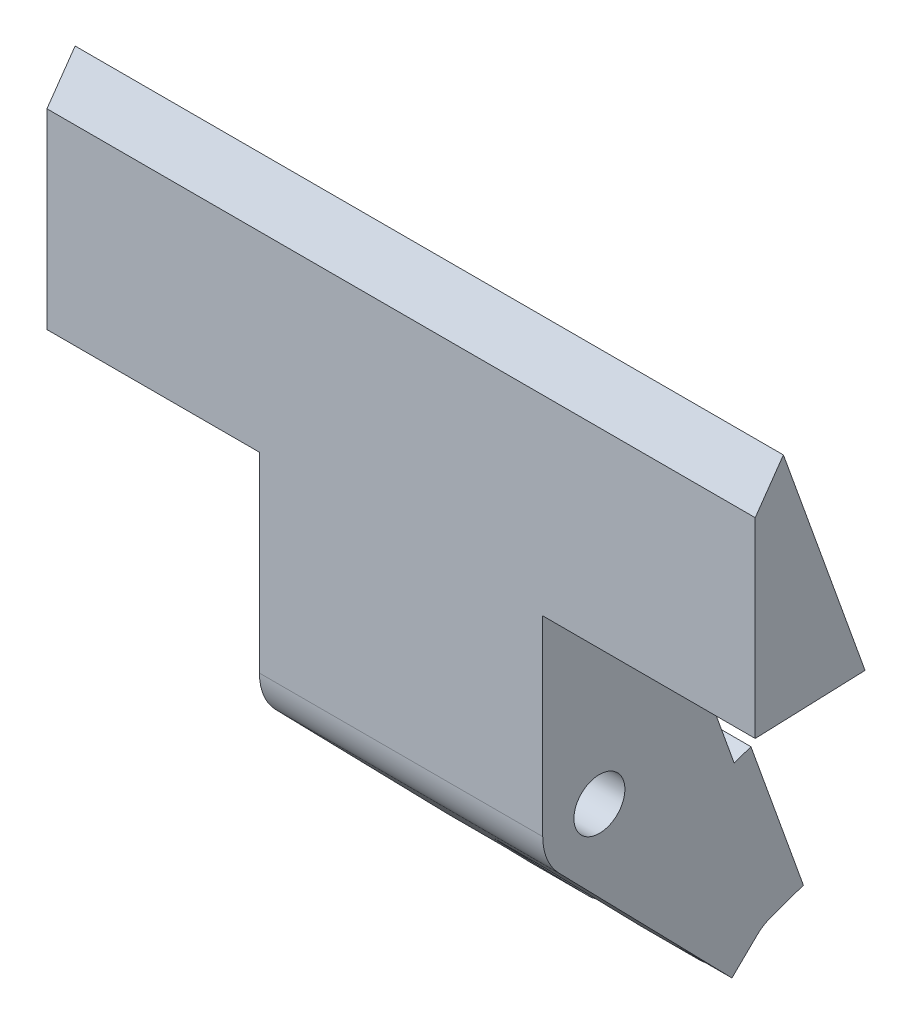
ISO-10303-21;
HEADER;
FILE_DESCRIPTION(('STEP AP214'),'2;1');
FILE_NAME('part.step','',(''),(''),'','','');
FILE_SCHEMA(('AUTOMOTIVE_DESIGN { 1 0 10303 214 1 1 1 1 }'));
ENDSEC;
DATA;
#1=APPLICATION_CONTEXT('core data for automotive mechanical design processes');
#2=APPLICATION_PROTOCOL_DEFINITION('international standard','automotive_design',2000,#1);
#3=PRODUCT_CONTEXT('',#1,'mechanical');
#4=PRODUCT('Part','Part','',(#3));
#5=PRODUCT_RELATED_PRODUCT_CATEGORY('part','',(#4));
#6=PRODUCT_DEFINITION_FORMATION('','',#4);
#7=PRODUCT_DEFINITION_CONTEXT('part definition',#1,'design');
#8=PRODUCT_DEFINITION('design','',#6,#7);
#9=PRODUCT_DEFINITION_SHAPE('','',#8);
#10=(LENGTH_UNIT() NAMED_UNIT(*) SI_UNIT(.MILLI.,.METRE.));
#11=(NAMED_UNIT(*) PLANE_ANGLE_UNIT() SI_UNIT($,.RADIAN.));
#12=(NAMED_UNIT(*) SI_UNIT($,.STERADIAN.) SOLID_ANGLE_UNIT());
#13=UNCERTAINTY_MEASURE_WITH_UNIT(LENGTH_MEASURE(1.E-05),#10,'distance_accuracy_value','');
#14=(GEOMETRIC_REPRESENTATION_CONTEXT(3) GLOBAL_UNCERTAINTY_ASSIGNED_CONTEXT((#13)) GLOBAL_UNIT_ASSIGNED_CONTEXT((#10,
#11,#12)) REPRESENTATION_CONTEXT('',''));
#15=CARTESIAN_POINT('',(0.,0.,0.));
#16=DIRECTION('',(0.,0.,1.));
#17=DIRECTION('',(1.,0.,0.));
#18=AXIS2_PLACEMENT_3D('',#15,#16,#17);
#19=CARTESIAN_POINT('',(-73.025,-14.3974585643111,-20.7213781381134));
#20=DIRECTION('',(1.,0.,0.));
#21=DIRECTION('',(0.,0.,-1.));
#22=AXIS2_PLACEMENT_3D('',#19,#20,#21);
#23=CYLINDRICAL_SURFACE('',#22,3.175);
#24=DIRECTION('',(1.,0.,0.));
#25=VECTOR('',#24,1.);
#26=CARTESIAN_POINT('',(-73.025,-16.6144968818002,-18.4486339600799));
#27=LINE('',#26,#25);
#28=CARTESIAN_POINT('',(-67.945,-16.6144968818002,-18.4486339600799));
#29=VERTEX_POINT('',#28);
#30=CARTESIAN_POINT('',(-62.611,-16.6144968818002,-18.4486339600799));
#31=VERTEX_POINT('',#30);
#32=EDGE_CURVE('E11',#29,#31,#27,.T.);
#33=ORIENTED_EDGE('',*,*,#32,.F.);
#34=CARTESIAN_POINT('',(-67.945,-14.3974585643111,-20.7213781381134));
#35=DIRECTION('',(1.,0.,0.));
#36=DIRECTION('',(0.,0.,-1.));
#37=AXIS2_PLACEMENT_3D('',#34,#35,#36);
#38=CIRCLE('',#37,3.175);
#39=CARTESIAN_POINT('',(-67.945,-13.3246020975457,-23.7096224389897));
#40=VERTEX_POINT('',#39);
#41=EDGE_CURVE('E195',#29,#40,#38,.T.);
#42=ORIENTED_EDGE('',*,*,#41,.T.);
#43=DIRECTION('',(1.,0.,0.));
#44=VECTOR('',#43,1.);
#45=CARTESIAN_POINT('',(-73.025,-13.3246020975457,-23.7096224389897));
#46=LINE('',#45,#44);
#47=CARTESIAN_POINT('',(-62.611,-13.3246020975457,-23.7096224389897));
#48=VERTEX_POINT('',#47);
#49=EDGE_CURVE('E219',#40,#48,#46,.T.);
#50=ORIENTED_EDGE('',*,*,#49,.T.);
#51=CARTESIAN_POINT('',(-62.611,-14.3974585643111,-20.7213781381134));
#52=DIRECTION('',(1.,0.,0.));
#53=DIRECTION('',(0.,0.,-1.));
#54=AXIS2_PLACEMENT_3D('',#51,#52,#53);
#55=CIRCLE('',#54,3.175);
#56=EDGE_CURVE('E218',#31,#48,#55,.T.);
#57=ORIENTED_EDGE('',*,*,#56,.F.);
#58=EDGE_LOOP('',(#33,#42,#50,#57));
#59=FACE_BOUND('',#58,.T.);
#60=ADVANCED_FACE('F34',(#59),#23,.T.);
#61=CARTESIAN_POINT('',(-73.025,-14.3974585643111,-20.7213781381134));
#62=DIRECTION('',(1.,0.,0.));
#63=DIRECTION('',(0.,0.,-1.));
#64=AXIS2_PLACEMENT_3D('',#61,#62,#63);
#65=CYLINDRICAL_SURFACE('',#64,1.3462);
#66=CARTESIAN_POINT('',(-62.611,-14.3974585643111,-20.7213781381134));
#67=DIRECTION('',(1.,0.,0.));
#68=DIRECTION('',(0.,0.,-1.));
#69=AXIS2_PLACEMENT_3D('',#66,#67,#68);
#70=CIRCLE('',#69,1.3462);
#71=CARTESIAN_POINT('',(-62.611,-14.3974585643111,-22.0675781381134));
#72=VERTEX_POINT('',#71);
#73=EDGE_CURVE('E38',#72,#72,#70,.F.);
#74=ORIENTED_EDGE('',*,*,#73,.F.);
#75=EDGE_LOOP('',(#74));
#76=FACE_BOUND('',#75,.T.);
#77=CARTESIAN_POINT('',(-67.945,-14.3974585643111,-20.7213781381134));
#78=DIRECTION('',(1.,0.,0.));
#79=DIRECTION('',(0.,0.,-1.));
#80=AXIS2_PLACEMENT_3D('',#77,#78,#79);
#81=CIRCLE('',#80,1.3462);
#82=CARTESIAN_POINT('',(-67.945,-14.3974585643111,-22.0675781381134));
#83=VERTEX_POINT('',#82);
#84=EDGE_CURVE('E204',#83,#83,#81,.F.);
#85=ORIENTED_EDGE('',*,*,#84,.T.);
#86=EDGE_LOOP('',(#85));
#87=FACE_BOUND('',#86,.T.);
#88=ADVANCED_FACE('F292',(#76,#87),#65,.F.);
#89=CARTESIAN_POINT('',(-47.625,-14.3974585643111,-20.7213781381134));
#90=DIRECTION('',(1.,0.,0.));
#91=DIRECTION('',(0.,0.,-1.));
#92=AXIS2_PLACEMENT_3D('',#89,#90,#91);
#93=PLANE('',#92);
#94=CARTESIAN_POINT('',(-47.625,5.11471785045048,-4.34871810502098));
#95=DIRECTION('',(1.,0.,0.));
#96=DIRECTION('',(0.,0.,-1.));
#97=AXIS2_PLACEMENT_3D('',#94,#95,#96);
#98=CIRCLE('',#97,2.286);
#99=CARTESIAN_POINT('',(-47.625,5.11471785045048,-6.63471810502098));
#100=VERTEX_POINT('',#99);
#101=EDGE_CURVE('E255',#100,#100,#98,.T.);
#102=ORIENTED_EDGE('',*,*,#101,.F.);
#103=EDGE_LOOP('',(#102));
#104=FACE_BOUND('',#103,.T.);
#105=DIRECTION('',(0.,-0.715824937963313,-0.698279785035926));
#106=VECTOR('',#105,1.);
#107=CARTESIAN_POINT('',(-47.625,1.56745654246798,-0.712327420167346));
#108=LINE('',#107,#106);
#109=CARTESIAN_POINT('',(-47.625,1.56745654246798,-0.712327420167346));
#110=VERTEX_POINT('',#109);
#111=CARTESIAN_POINT('',(-47.625,-14.3417527037666,-16.2315956425908));
#112=VERTEX_POINT('',#111);
#113=EDGE_CURVE('E261',#110,#112,#108,.T.);
#114=ORIENTED_EDGE('',*,*,#113,.T.);
#115=DIRECTION('',(0.,0.698279785035927,-0.715824937963312));
#116=VECTOR('',#115,1.);
#117=CARTESIAN_POINT('',(-47.625,-15.4620902121758,-15.083108253093));
#118=LINE('',#117,#116);
#119=CARTESIAN_POINT('',(-47.625,-12.1247143862776,-18.5043398206243));
#120=VERTEX_POINT('',#119);
#121=EDGE_CURVE('E328',#112,#120,#118,.T.);
#122=ORIENTED_EDGE('',*,*,#121,.T.);
#123=CARTESIAN_POINT('',(-47.625,-14.3974585643111,-20.7213781381134));
#124=DIRECTION('',(1.,0.,0.));
#125=DIRECTION('',(0.,0.,-1.));
#126=AXIS2_PLACEMENT_3D('',#123,#124,#125);
#127=CIRCLE('',#126,3.175);
#128=CARTESIAN_POINT('',(-47.625,-11.4092142634348,-19.648521671348));
#129=VERTEX_POINT('',#128);
#130=EDGE_CURVE('E340',#129,#120,#127,.T.);
#131=ORIENTED_EDGE('',*,*,#130,.F.);
#132=DIRECTION('',(0.,0.337907548587539,-0.941179307362609));
#133=VECTOR('',#132,1.);
#134=CARTESIAN_POINT('',(-47.625,-16.3553435730782,-5.87198848280307));
#135=LINE('',#134,#133);
#136=CARTESIAN_POINT('',(-47.625,-10.3363577966694,-22.6367659722242));
#137=VERTEX_POINT('',#136);
#138=EDGE_CURVE('E318',#129,#137,#135,.T.);
#139=ORIENTED_EDGE('',*,*,#138,.T.);
#140=DIRECTION('',(0.,0.941179307362609,0.337907548587539));
#141=VECTOR('',#140,1.);
#142=CARTESIAN_POINT('',(-47.625,-13.3246020975457,-23.7096224389897));
#143=LINE('',#142,#141);
#144=CARTESIAN_POINT('',(-47.625,2.77091311941762,-17.9309190105662));
#145=VERTEX_POINT('',#144);
#146=EDGE_CURVE('E254',#137,#145,#143,.T.);
#147=ORIENTED_EDGE('',*,*,#146,.T.);
#148=DIRECTION('',(0.,0.337907548587539,-0.941179307362609));
#149=VECTOR('',#148,1.);
#150=CARTESIAN_POINT('',(-47.625,2.2344848860349,-16.4367968601281));
#151=LINE('',#150,#149);
#152=CARTESIAN_POINT('',(-47.625,2.2344848860349,-16.4367968601281));
#153=VERTEX_POINT('',#152);
#154=EDGE_CURVE('E396',#153,#145,#151,.T.);
#155=ORIENTED_EDGE('',*,*,#154,.F.);
#156=DIRECTION('',(0.,-0.941179307362609,-0.337907548587539));
#157=VECTOR('',#156,1.);
#158=CARTESIAN_POINT('',(-47.625,43.013942133981,-1.79592415543857));
#159=LINE('',#158,#157);
#160=CARTESIAN_POINT('',(-47.625,22.6242135100079,-9.11636050778334));
#161=VERTEX_POINT('',#160);
#162=EDGE_CURVE('E392',#161,#153,#159,.T.);
#163=ORIENTED_EDGE('',*,*,#162,.F.);
#164=DIRECTION('',(0.,-0.0369881664673555,0.999315703639938));
#165=VECTOR('',#164,1.);
#166=CARTESIAN_POINT('',(-47.625,23.0025178458458,-19.337074310709));
#167=LINE('',#166,#165);
#168=CARTESIAN_POINT('',(-47.625,22.2597178504505,0.731281894979024));
#169=VERTEX_POINT('',#168);
#170=EDGE_CURVE('E386',#161,#169,#167,.T.);
#171=ORIENTED_EDGE('',*,*,#170,.T.);
#172=DIRECTION('',(0.,-1.,0.));
#173=VECTOR('',#172,1.);
#174=CARTESIAN_POINT('',(-47.625,39.4047178504505,0.731281894979026));
#175=LINE('',#174,#173);
#176=CARTESIAN_POINT('',(-47.625,5.11471785045048,0.731281894979021));
#177=VERTEX_POINT('',#176);
#178=EDGE_CURVE('E270',#169,#177,#175,.T.);
#179=ORIENTED_EDGE('',*,*,#178,.T.);
#180=CARTESIAN_POINT('',(-47.625,5.11471785045048,-4.34871810502098));
#181=DIRECTION('',(1.,0.,0.));
#182=DIRECTION('',(0.,0.,-1.));
#183=AXIS2_PLACEMENT_3D('',#180,#181,#182);
#184=CIRCLE('',#183,5.08);
#185=EDGE_CURVE('E272',#177,#110,#184,.T.);
#186=ORIENTED_EDGE('',*,*,#185,.T.);
#187=EDGE_LOOP('',(#114,#122,#131,#139,#147,#155,#163,#171,#179,#186));
#188=FACE_BOUND('',#187,.T.);
#189=ADVANCED_FACE('F295',(#104,#188),#93,.T.);
#190=CARTESIAN_POINT('',(-73.025,1.56745654246798,-0.712327420167346));
#191=DIRECTION('',(0.,-0.698279785035926,0.715824937963313));
#192=DIRECTION('',(0.,-0.715824937963313,-0.698279785035926));
#193=AXIS2_PLACEMENT_3D('',#190,#191,#192);
#194=PLANE('',#193);
#195=DIRECTION('',(-1.,0.,0.));
#196=VECTOR('',#195,1.);
#197=CARTESIAN_POINT('',(-67.945,-14.3417527037666,-16.2315956425908));
#198=LINE('',#197,#196);
#199=CARTESIAN_POINT('',(-67.945,-14.3417527037666,-16.2315956425908));
#200=VERTEX_POINT('',#199);
#201=CARTESIAN_POINT('',(-73.025,-14.3417527037666,-16.2315956425908));
#202=VERTEX_POINT('',#201);
#203=EDGE_CURVE('E213',#200,#202,#198,.T.);
#204=ORIENTED_EDGE('',*,*,#203,.F.);
#205=DIRECTION('',(0.,-0.715824937963313,-0.698279785035926));
#206=VECTOR('',#205,1.);
#207=CARTESIAN_POINT('',(-67.945,1.12033750840919,-1.14848738949778));
#208=LINE('',#207,#206);
#209=EDGE_CURVE('E199',#200,#29,#208,.T.);
#210=ORIENTED_EDGE('',*,*,#209,.T.);
#211=ORIENTED_EDGE('',*,*,#32,.T.);
#212=DIRECTION('',(0.,-0.715824937963313,-0.698279785035926));
#213=VECTOR('',#212,1.);
#214=CARTESIAN_POINT('',(-62.611,-7.52352016966609,-9.58048069012361));
#215=LINE('',#214,#213);
#216=CARTESIAN_POINT('',(-62.611,-7.52352016966609,-9.58048069012361));
#217=VERTEX_POINT('',#216);
#218=EDGE_CURVE('E224',#217,#31,#215,.T.);
#219=ORIENTED_EDGE('',*,*,#218,.F.);
#220=DIRECTION('',(1.,0.,0.));
#221=VECTOR('',#220,1.);
#222=CARTESIAN_POINT('',(-62.611,-7.52352016966609,-9.58048069012361));
#223=LINE('',#222,#221);
#224=CARTESIAN_POINT('',(-58.039,-7.52352016966609,-9.58048069012361));
#225=VERTEX_POINT('',#224);
#226=EDGE_CURVE('E226',#217,#225,#223,.T.);
#227=ORIENTED_EDGE('',*,*,#226,.T.);
#228=DIRECTION('',(0.,-0.715824937963313,-0.698279785035926));
#229=VECTOR('',#228,1.);
#230=CARTESIAN_POINT('',(-58.039,-7.52352016966609,-9.58048069012361));
#231=LINE('',#230,#229);
#232=CARTESIAN_POINT('',(-58.039,-16.6144968818002,-18.4486339600799));
#233=VERTEX_POINT('',#232);
#234=EDGE_CURVE('E235',#225,#233,#231,.T.);
#235=ORIENTED_EDGE('',*,*,#234,.T.);
#236=CARTESIAN_POINT('',(-52.705,-16.6144968818002,-18.4486339600799));
#237=VERTEX_POINT('',#236);
#238=EDGE_CURVE('E43',#233,#237,#27,.T.);
#239=ORIENTED_EDGE('',*,*,#238,.T.);
#240=DIRECTION('',(0.,-0.715824937963313,-0.698279785035926));
#241=VECTOR('',#240,1.);
#242=CARTESIAN_POINT('',(-52.705,1.12033750840919,-1.14848738949778));
#243=LINE('',#242,#241);
#244=CARTESIAN_POINT('',(-52.705,-14.3417527037666,-16.2315956425908));
#245=VERTEX_POINT('',#244);
#246=EDGE_CURVE('E59',#245,#237,#243,.T.);
#247=ORIENTED_EDGE('',*,*,#246,.F.);
#248=DIRECTION('',(1.,0.,0.));
#249=VECTOR('',#248,1.);
#250=CARTESIAN_POINT('',(-52.705,-14.3417527037666,-16.2315956425908));
#251=LINE('',#250,#249);
#252=EDGE_CURVE('E347',#245,#112,#251,.T.);
#253=ORIENTED_EDGE('',*,*,#252,.T.);
#254=ORIENTED_EDGE('',*,*,#113,.F.);
#255=DIRECTION('',(1.,0.,0.));
#256=VECTOR('',#255,1.);
#257=CARTESIAN_POINT('',(-73.025,1.56745654246798,-0.712327420167346));
#258=LINE('',#257,#256);
#259=CARTESIAN_POINT('',(-73.025,1.56745654246798,-0.712327420167346));
#260=VERTEX_POINT('',#259);
#261=EDGE_CURVE('E277',#260,#110,#258,.T.);
#262=ORIENTED_EDGE('',*,*,#261,.F.);
#263=DIRECTION('',(0.,-0.715824937963313,-0.698279785035926));
#264=VECTOR('',#263,1.);
#265=CARTESIAN_POINT('',(-73.025,1.56745654246798,-0.712327420167346));
#266=LINE('',#265,#264);
#267=EDGE_CURVE('E266',#260,#202,#266,.T.);
#268=ORIENTED_EDGE('',*,*,#267,.T.);
#269=EDGE_LOOP('',(#204,#210,#211,#219,#227,#235,#239,#247,#253,#254,#262,#268));
#270=FACE_BOUND('',#269,.T.);
#271=ADVANCED_FACE('F209',(#270),#194,.T.);
#272=CARTESIAN_POINT('',(-73.025,-13.3246020975457,-23.7096224389897));
#273=DIRECTION('',(0.,0.337907548587539,-0.941179307362609));
#274=DIRECTION('',(0.,0.941179307362609,0.337907548587539));
#275=AXIS2_PLACEMENT_3D('',#272,#273,#274);
#276=PLANE('',#275);
#277=DIRECTION('',(-1.,0.,0.));
#278=VECTOR('',#277,1.);
#279=CARTESIAN_POINT('',(-67.945,-10.3363577966694,-22.6367659722242));
#280=LINE('',#279,#278);
#281=CARTESIAN_POINT('',(-67.945,-10.3363577966694,-22.6367659722242));
#282=VERTEX_POINT('',#281);
#283=CARTESIAN_POINT('',(-73.025,-10.3363577966694,-22.6367659722242));
#284=VERTEX_POINT('',#283);
#285=EDGE_CURVE('E315',#282,#284,#280,.T.);
#286=ORIENTED_EDGE('',*,*,#285,.T.);
#287=DIRECTION('',(0.,0.941179307362609,0.337907548587539));
#288=VECTOR('',#287,1.);
#289=CARTESIAN_POINT('',(-73.025,-13.3246020975457,-23.7096224389897));
#290=LINE('',#289,#288);
#291=CARTESIAN_POINT('',(-73.025,2.77091311941762,-17.9309190105662));
#292=VERTEX_POINT('',#291);
#293=EDGE_CURVE('E258',#284,#292,#290,.T.);
#294=ORIENTED_EDGE('',*,*,#293,.T.);
#295=DIRECTION('',(1.,0.,0.));
#296=VECTOR('',#295,1.);
#297=CARTESIAN_POINT('',(-73.025,2.77091311941762,-17.9309190105662));
#298=LINE('',#297,#296);
#299=EDGE_CURVE('E236',#292,#145,#298,.T.);
#300=ORIENTED_EDGE('',*,*,#299,.T.);
#301=ORIENTED_EDGE('',*,*,#146,.F.);
#302=DIRECTION('',(1.,0.,0.));
#303=VECTOR('',#302,1.);
#304=CARTESIAN_POINT('',(-52.705,-10.3363577966694,-22.6367659722242));
#305=LINE('',#304,#303);
#306=CARTESIAN_POINT('',(-52.705,-10.3363577966694,-22.6367659722242));
#307=VERTEX_POINT('',#306);
#308=EDGE_CURVE('E339',#307,#137,#305,.T.);
#309=ORIENTED_EDGE('',*,*,#308,.F.);
#310=DIRECTION('',(0.,0.941179307362609,0.337907548587539));
#311=VECTOR('',#310,1.);
#312=CARTESIAN_POINT('',(-52.705,6.01898577640883,-16.7647774894211));
#313=LINE('',#312,#311);
#314=CARTESIAN_POINT('',(-52.705,-13.3246020975457,-23.7096224389897));
#315=VERTEX_POINT('',#314);
#316=EDGE_CURVE('E330',#315,#307,#313,.T.);
#317=ORIENTED_EDGE('',*,*,#316,.F.);
#318=CARTESIAN_POINT('',(-58.039,-13.3246020975457,-23.7096224389897));
#319=VERTEX_POINT('',#318);
#320=EDGE_CURVE('E268',#319,#315,#46,.T.);
#321=ORIENTED_EDGE('',*,*,#320,.F.);
#322=DIRECTION('',(0.,0.941179307362609,0.337907548587539));
#323=VECTOR('',#322,1.);
#324=CARTESIAN_POINT('',(-58.039,-13.3246020975457,-23.7096224389897));
#325=LINE('',#324,#323);
#326=CARTESIAN_POINT('',(-58.039,1.17957374533877,-18.5022507245758));
#327=VERTEX_POINT('',#326);
#328=EDGE_CURVE('E242',#319,#327,#325,.T.);
#329=ORIENTED_EDGE('',*,*,#328,.T.);
#330=DIRECTION('',(1.,0.,0.));
#331=VECTOR('',#330,1.);
#332=CARTESIAN_POINT('',(-62.611,1.17957374533877,-18.5022507245758));
#333=LINE('',#332,#331);
#334=CARTESIAN_POINT('',(-62.611,1.17957374533877,-18.5022507245758));
#335=VERTEX_POINT('',#334);
#336=EDGE_CURVE('E245',#335,#327,#333,.T.);
#337=ORIENTED_EDGE('',*,*,#336,.F.);
#338=DIRECTION('',(0.,0.941179307362609,0.337907548587539));
#339=VECTOR('',#338,1.);
#340=CARTESIAN_POINT('',(-62.611,-13.3246020975457,-23.7096224389897));
#341=LINE('',#340,#339);
#342=EDGE_CURVE('E223',#48,#335,#341,.T.);
#343=ORIENTED_EDGE('',*,*,#342,.F.);
#344=ORIENTED_EDGE('',*,*,#49,.F.);
#345=DIRECTION('',(0.,0.941179307362609,0.337907548587539));
#346=VECTOR('',#345,1.);
#347=CARTESIAN_POINT('',(-67.945,6.01898577640883,-16.7647774894211));
#348=LINE('',#347,#346);
#349=EDGE_CURVE('E51',#40,#282,#348,.T.);
#350=ORIENTED_EDGE('',*,*,#349,.T.);
#351=EDGE_LOOP('',(#286,#294,#300,#301,#309,#317,#321,#329,#337,#343,#344,#350));
#352=FACE_BOUND('',#351,.T.);
#353=ADVANCED_FACE('F422',(#352),#276,.T.);
#354=ORIENTED_EDGE('',*,*,#320,.T.);
#355=CARTESIAN_POINT('',(-52.705,-14.3974585643111,-20.7213781381134));
#356=DIRECTION('',(1.,0.,0.));
#357=DIRECTION('',(0.,0.,-1.));
#358=AXIS2_PLACEMENT_3D('',#355,#356,#357);
#359=CIRCLE('',#358,3.175);
#360=EDGE_CURVE('E327',#237,#315,#359,.T.);
#361=ORIENTED_EDGE('',*,*,#360,.F.);
#362=ORIENTED_EDGE('',*,*,#238,.F.);
#363=CARTESIAN_POINT('',(-58.039,-14.3974585643111,-20.7213781381134));
#364=DIRECTION('',(1.,0.,0.));
#365=DIRECTION('',(0.,0.,-1.));
#366=AXIS2_PLACEMENT_3D('',#363,#364,#365);
#367=CIRCLE('',#366,3.175);
#368=EDGE_CURVE('E239',#233,#319,#367,.T.);
#369=ORIENTED_EDGE('',*,*,#368,.T.);
#370=EDGE_LOOP('',(#354,#361,#362,#369));
#371=FACE_BOUND('',#370,.T.);
#372=ADVANCED_FACE('F36',(#371),#23,.T.);
#373=CARTESIAN_POINT('',(-58.039,-14.3974585643111,-20.7213781381134));
#374=DIRECTION('',(1.,0.,0.));
#375=DIRECTION('',(0.,0.,-1.));
#376=AXIS2_PLACEMENT_3D('',#373,#374,#375);
#377=CIRCLE('',#376,1.3462);
#378=CARTESIAN_POINT('',(-58.039,-14.3974585643111,-22.0675781381134));
#379=VERTEX_POINT('',#378);
#380=EDGE_CURVE('E248',#379,#379,#377,.F.);
#381=ORIENTED_EDGE('',*,*,#380,.T.);
#382=EDGE_LOOP('',(#381));
#383=FACE_BOUND('',#382,.T.);
#384=CARTESIAN_POINT('',(-52.705,-14.3974585643111,-20.7213781381134));
#385=DIRECTION('',(1.,0.,0.));
#386=DIRECTION('',(0.,0.,-1.));
#387=AXIS2_PLACEMENT_3D('',#384,#385,#386);
#388=CIRCLE('',#387,1.3462);
#389=CARTESIAN_POINT('',(-52.705,-14.3974585643111,-22.0675781381134));
#390=VERTEX_POINT('',#389);
#391=EDGE_CURVE('E324',#390,#390,#388,.F.);
#392=ORIENTED_EDGE('',*,*,#391,.F.);
#393=EDGE_LOOP('',(#392));
#394=FACE_BOUND('',#393,.T.);
#395=ADVANCED_FACE('F297',(#383,#394),#65,.F.);
#396=CARTESIAN_POINT('',(-73.025,-14.3974585643111,-20.7213781381134));
#397=DIRECTION('',(1.,0.,0.));
#398=DIRECTION('',(0.,0.,-1.));
#399=AXIS2_PLACEMENT_3D('',#396,#397,#398);
#400=PLANE('',#399);
#401=CARTESIAN_POINT('',(-73.025,5.11471785045048,-4.34871810502098));
#402=DIRECTION('',(1.,0.,0.));
#403=DIRECTION('',(0.,0.,-1.));
#404=AXIS2_PLACEMENT_3D('',#401,#402,#403);
#405=CIRCLE('',#404,2.286);
#406=CARTESIAN_POINT('',(-73.025,5.11471785045048,-6.63471810502098));
#407=VERTEX_POINT('',#406);
#408=EDGE_CURVE('E251',#407,#407,#405,.T.);
#409=ORIENTED_EDGE('',*,*,#408,.T.);
#410=EDGE_LOOP('',(#409));
#411=FACE_BOUND('',#410,.T.);
#412=ORIENTED_EDGE('',*,*,#293,.F.);
#413=DIRECTION('',(0.,0.337907548587539,-0.941179307362609));
#414=VECTOR('',#413,1.);
#415=CARTESIAN_POINT('',(-73.025,-16.3553435730782,-5.87198848280307));
#416=LINE('',#415,#414);
#417=CARTESIAN_POINT('',(-73.025,-11.4092142634348,-19.648521671348));
#418=VERTEX_POINT('',#417);
#419=EDGE_CURVE('E301',#418,#284,#416,.T.);
#420=ORIENTED_EDGE('',*,*,#419,.F.);
#421=CARTESIAN_POINT('',(-73.025,-14.3974585643111,-20.7213781381134));
#422=DIRECTION('',(1.,0.,0.));
#423=DIRECTION('',(0.,0.,-1.));
#424=AXIS2_PLACEMENT_3D('',#421,#422,#423);
#425=CIRCLE('',#424,3.175);
#426=CARTESIAN_POINT('',(-73.025,-12.1247143862776,-18.5043398206243));
#427=VERTEX_POINT('',#426);
#428=EDGE_CURVE('E303',#418,#427,#425,.T.);
#429=ORIENTED_EDGE('',*,*,#428,.T.);
#430=DIRECTION('',(0.,0.698279785035927,-0.715824937963312));
#431=VECTOR('',#430,1.);
#432=CARTESIAN_POINT('',(-73.025,-15.4620902121758,-15.083108253093));
#433=LINE('',#432,#431);
#434=EDGE_CURVE('E312',#202,#427,#433,.T.);
#435=ORIENTED_EDGE('',*,*,#434,.F.);
#436=ORIENTED_EDGE('',*,*,#267,.F.);
#437=CARTESIAN_POINT('',(-73.025,5.11471785045048,-4.34871810502098));
#438=DIRECTION('',(1.,0.,0.));
#439=DIRECTION('',(0.,0.,-1.));
#440=AXIS2_PLACEMENT_3D('',#437,#438,#439);
#441=CIRCLE('',#440,5.08);
#442=CARTESIAN_POINT('',(-73.025,5.11471785045048,0.731281894979021));
#443=VERTEX_POINT('',#442);
#444=EDGE_CURVE('E263',#443,#260,#441,.T.);
#445=ORIENTED_EDGE('',*,*,#444,.F.);
#446=DIRECTION('',(0.,-1.,0.));
#447=VECTOR('',#446,1.);
#448=CARTESIAN_POINT('',(-73.025,39.4047178504505,0.731281894979026));
#449=LINE('',#448,#447);
#450=CARTESIAN_POINT('',(-73.025,22.2597178504505,0.731281894979024));
#451=VERTEX_POINT('',#450);
#452=EDGE_CURVE('E260',#451,#443,#449,.T.);
#453=ORIENTED_EDGE('',*,*,#452,.F.);
#454=DIRECTION('',(0.,-0.0369881664673555,0.999315703639938));
#455=VECTOR('',#454,1.);
#456=CARTESIAN_POINT('',(-73.025,23.0025178458458,-19.337074310709));
#457=LINE('',#456,#455);
#458=CARTESIAN_POINT('',(-73.025,22.6242135100079,-9.11636050778333));
#459=VERTEX_POINT('',#458);
#460=EDGE_CURVE('E389',#459,#451,#457,.T.);
#461=ORIENTED_EDGE('',*,*,#460,.F.);
#462=DIRECTION('',(0.,-0.941179307362609,-0.337907548587539));
#463=VECTOR('',#462,1.);
#464=CARTESIAN_POINT('',(-73.025,43.013942133981,-1.79592415543857));
#465=LINE('',#464,#463);
#466=CARTESIAN_POINT('',(-73.025,2.2344848860349,-16.4367968601281));
#467=VERTEX_POINT('',#466);
#468=EDGE_CURVE('E393',#459,#467,#465,.T.);
#469=ORIENTED_EDGE('',*,*,#468,.T.);
#470=DIRECTION('',(0.,0.337907548587539,-0.941179307362609));
#471=VECTOR('',#470,1.);
#472=CARTESIAN_POINT('',(-73.025,2.2344848860349,-16.4367968601281));
#473=LINE('',#472,#471);
#474=EDGE_CURVE('E395',#467,#292,#473,.T.);
#475=ORIENTED_EDGE('',*,*,#474,.T.);
#476=EDGE_LOOP('',(#412,#420,#429,#435,#436,#445,#453,#461,#469,#475));
#477=FACE_BOUND('',#476,.T.);
#478=ADVANCED_FACE('F442',(#411,#477),#400,.F.);
#479=CARTESIAN_POINT('',(-73.025,5.11471785045048,-4.34871810502098));
#480=DIRECTION('',(1.,0.,0.));
#481=DIRECTION('',(0.,0.,-1.));
#482=AXIS2_PLACEMENT_3D('',#479,#480,#481);
#483=CYLINDRICAL_SURFACE('',#482,5.08);
#484=ORIENTED_EDGE('',*,*,#185,.F.);
#485=DIRECTION('',(1.,0.,0.));
#486=VECTOR('',#485,1.);
#487=CARTESIAN_POINT('',(-73.025,5.11471785045048,0.731281894979021));
#488=LINE('',#487,#486);
#489=EDGE_CURVE('E279',#443,#177,#488,.T.);
#490=ORIENTED_EDGE('',*,*,#489,.F.);
#491=ORIENTED_EDGE('',*,*,#444,.T.);
#492=ORIENTED_EDGE('',*,*,#261,.T.);
#493=EDGE_LOOP('',(#484,#490,#491,#492));
#494=FACE_BOUND('',#493,.T.);
#495=ADVANCED_FACE('F436',(#494),#483,.T.);
#496=CARTESIAN_POINT('',(-73.025,39.4047178504505,0.731281894979026));
#497=DIRECTION('',(0.,0.,1.));
#498=DIRECTION('',(0.,-1.,0.));
#499=AXIS2_PLACEMENT_3D('',#496,#497,#498);
#500=PLANE('',#499);
#501=DIRECTION('',(-1.,0.,0.));
#502=VECTOR('',#501,1.);
#503=CARTESIAN_POINT('',(-28.575,22.2597178504505,0.731281894979024));
#504=LINE('',#503,#502);
#505=CARTESIAN_POINT('',(-92.075,22.2597178504505,0.731281894979024));
#506=VERTEX_POINT('',#505);
#507=EDGE_CURVE('E368',#451,#506,#504,.T.);
#508=ORIENTED_EDGE('',*,*,#507,.F.);
#509=ORIENTED_EDGE('',*,*,#452,.T.);
#510=ORIENTED_EDGE('',*,*,#489,.T.);
#511=ORIENTED_EDGE('',*,*,#178,.F.);
#512=CARTESIAN_POINT('',(-28.575,22.2597178504505,0.731281894979024));
#513=VERTEX_POINT('',#512);
#514=EDGE_CURVE('E379',#513,#169,#504,.T.);
#515=ORIENTED_EDGE('',*,*,#514,.F.);
#516=DIRECTION('',(0.,-1.,0.));
#517=VECTOR('',#516,1.);
#518=CARTESIAN_POINT('',(-28.575,22.2597178504505,0.731281894979024));
#519=LINE('',#518,#517);
#520=CARTESIAN_POINT('',(-28.575,39.4047178504505,0.731281894979026));
#521=VERTEX_POINT('',#520);
#522=EDGE_CURVE('E366',#521,#513,#519,.T.);
#523=ORIENTED_EDGE('',*,*,#522,.F.);
#524=DIRECTION('',(1.,0.,0.));
#525=VECTOR('',#524,1.);
#526=CARTESIAN_POINT('',(-73.025,39.4047178504505,0.731281894979026));
#527=LINE('',#526,#525);
#528=CARTESIAN_POINT('',(-92.075,39.4047178504505,0.731281894979026));
#529=VERTEX_POINT('',#528);
#530=EDGE_CURVE('E282',#529,#521,#527,.T.);
#531=ORIENTED_EDGE('',*,*,#530,.F.);
#532=DIRECTION('',(0.,-1.,0.));
#533=VECTOR('',#532,1.);
#534=CARTESIAN_POINT('',(-92.075,22.2597178504505,0.731281894979024));
#535=LINE('',#534,#533);
#536=EDGE_CURVE('E360',#529,#506,#535,.T.);
#537=ORIENTED_EDGE('',*,*,#536,.T.);
#538=EDGE_LOOP('',(#508,#509,#510,#511,#515,#523,#531,#537));
#539=FACE_BOUND('',#538,.T.);
#540=ADVANCED_FACE('F498',(#539),#500,.T.);
#541=CARTESIAN_POINT('',(-73.025,44.6063333316856,-2.91092847585012));
#542=DIRECTION('',(0.,0.573576436351047,0.819152044288991));
#543=DIRECTION('',(0.,-0.819152044288991,0.573576436351047));
#544=AXIS2_PLACEMENT_3D('',#541,#542,#543);
#545=PLANE('',#544);
#546=DIRECTION('',(1.,0.,0.));
#547=VECTOR('',#546,1.);
#548=CARTESIAN_POINT('',(-73.025,43.013942133981,-1.79592415543857));
#549=LINE('',#548,#547);
#550=CARTESIAN_POINT('',(-92.075,43.013942133981,-1.79592415543857));
#551=VERTEX_POINT('',#550);
#552=CARTESIAN_POINT('',(-28.575,43.013942133981,-1.79592415543857));
#553=VERTEX_POINT('',#552);
#554=EDGE_CURVE('E399',#551,#553,#549,.T.);
#555=ORIENTED_EDGE('',*,*,#554,.F.);
#556=DIRECTION('',(0.,-0.819152044288991,0.573576436351047));
#557=VECTOR('',#556,1.);
#558=CARTESIAN_POINT('',(-92.075,39.4047178504505,0.731281894979026));
#559=LINE('',#558,#557);
#560=EDGE_CURVE('E374',#551,#529,#559,.T.);
#561=ORIENTED_EDGE('',*,*,#560,.T.);
#562=ORIENTED_EDGE('',*,*,#530,.T.);
#563=DIRECTION('',(0.,-0.819152044288991,0.573576436351047));
#564=VECTOR('',#563,1.);
#565=CARTESIAN_POINT('',(-28.575,39.4047178504505,0.731281894979026));
#566=LINE('',#565,#564);
#567=EDGE_CURVE('E363',#553,#521,#566,.T.);
#568=ORIENTED_EDGE('',*,*,#567,.F.);
#569=EDGE_LOOP('',(#555,#561,#562,#568));
#570=FACE_BOUND('',#569,.T.);
#571=ADVANCED_FACE('F494',(#570),#545,.T.);
#572=CARTESIAN_POINT('',(-73.025,5.11471785045048,-4.34871810502098));
#573=DIRECTION('',(1.,0.,0.));
#574=DIRECTION('',(0.,0.,-1.));
#575=AXIS2_PLACEMENT_3D('',#572,#573,#574);
#576=CYLINDRICAL_SURFACE('',#575,2.286);
#577=ORIENTED_EDGE('',*,*,#408,.F.);
#578=EDGE_LOOP('',(#577));
#579=FACE_BOUND('',#578,.T.);
#580=ORIENTED_EDGE('',*,*,#101,.T.);
#581=EDGE_LOOP('',(#580));
#582=FACE_BOUND('',#581,.T.);
#583=ADVANCED_FACE('F497',(#579,#582),#576,.F.);
#584=CARTESIAN_POINT('',(-62.611,-14.3974585643111,-20.7213781381134));
#585=DIRECTION('',(1.,0.,0.));
#586=DIRECTION('',(0.,0.,-1.));
#587=AXIS2_PLACEMENT_3D('',#584,#585,#586);
#588=PLANE('',#587);
#589=DIRECTION('',(0.,-0.698279785035926,0.715824937963313));
#590=VECTOR('',#589,1.);
#591=CARTESIAN_POINT('',(-62.611,1.17957374533877,-18.5022507245758));
#592=LINE('',#591,#590);
#593=EDGE_CURVE('E228',#335,#217,#592,.T.);
#594=ORIENTED_EDGE('',*,*,#593,.T.);
#595=ORIENTED_EDGE('',*,*,#218,.T.);
#596=ORIENTED_EDGE('',*,*,#56,.T.);
#597=ORIENTED_EDGE('',*,*,#342,.T.);
#598=EDGE_LOOP('',(#594,#595,#596,#597));
#599=FACE_BOUND('',#598,.T.);
#600=ORIENTED_EDGE('',*,*,#73,.T.);
#601=EDGE_LOOP('',(#600));
#602=FACE_BOUND('',#601,.T.);
#603=ADVANCED_FACE('F290',(#599,#602),#588,.T.);
#604=CARTESIAN_POINT('',(-58.039,-14.3974585643111,-20.7213781381134));
#605=DIRECTION('',(1.,0.,0.));
#606=DIRECTION('',(0.,0.,-1.));
#607=AXIS2_PLACEMENT_3D('',#604,#605,#606);
#608=PLANE('',#607);
#609=DIRECTION('',(0.,-0.698279785035926,0.715824937963313));
#610=VECTOR('',#609,1.);
#611=CARTESIAN_POINT('',(-58.039,1.17957374533877,-18.5022507245758));
#612=LINE('',#611,#610);
#613=EDGE_CURVE('E232',#327,#225,#612,.T.);
#614=ORIENTED_EDGE('',*,*,#613,.F.);
#615=ORIENTED_EDGE('',*,*,#328,.F.);
#616=ORIENTED_EDGE('',*,*,#368,.F.);
#617=ORIENTED_EDGE('',*,*,#234,.F.);
#618=EDGE_LOOP('',(#614,#615,#616,#617));
#619=FACE_BOUND('',#618,.T.);
#620=ORIENTED_EDGE('',*,*,#380,.F.);
#621=EDGE_LOOP('',(#620));
#622=FACE_BOUND('',#621,.T.);
#623=ADVANCED_FACE('F415',(#619,#622),#608,.F.);
#624=CARTESIAN_POINT('',(-62.611,1.17957374533877,-18.5022507245758));
#625=DIRECTION('',(0.,0.715824937963313,0.698279785035926));
#626=DIRECTION('',(0.,-0.698279785035926,0.715824937963313));
#627=AXIS2_PLACEMENT_3D('',#624,#625,#626);
#628=PLANE('',#627);
#629=ORIENTED_EDGE('',*,*,#613,.T.);
#630=ORIENTED_EDGE('',*,*,#226,.F.);
#631=ORIENTED_EDGE('',*,*,#593,.F.);
#632=ORIENTED_EDGE('',*,*,#336,.T.);
#633=EDGE_LOOP('',(#629,#630,#631,#632));
#634=FACE_BOUND('',#633,.T.);
#635=ADVANCED_FACE('F413',(#634),#628,.F.);
#636=CARTESIAN_POINT('',(-73.025,2.2344848860349,-16.4367968601281));
#637=DIRECTION('',(0.,-0.941179307362609,-0.337907548587539));
#638=DIRECTION('',(0.,0.337907548587539,-0.941179307362609));
#639=AXIS2_PLACEMENT_3D('',#636,#637,#638);
#640=PLANE('',#639);
#641=ORIENTED_EDGE('',*,*,#154,.T.);
#642=ORIENTED_EDGE('',*,*,#299,.F.);
#643=ORIENTED_EDGE('',*,*,#474,.F.);
#644=DIRECTION('',(1.,0.,0.));
#645=VECTOR('',#644,1.);
#646=CARTESIAN_POINT('',(-73.025,2.2344848860349,-16.4367968601281));
#647=LINE('',#646,#645);
#648=EDGE_CURVE('E405',#467,#153,#647,.T.);
#649=ORIENTED_EDGE('',*,*,#648,.T.);
#650=EDGE_LOOP('',(#641,#642,#643,#649));
#651=FACE_BOUND('',#650,.T.);
#652=ADVANCED_FACE('F460',(#651),#640,.F.);
#653=CARTESIAN_POINT('',(-73.025,43.013942133981,-1.79592415543857));
#654=DIRECTION('',(0.,-0.337907548587539,0.941179307362609));
#655=DIRECTION('',(0.,-0.941179307362609,-0.337907548587539));
#656=AXIS2_PLACEMENT_3D('',#653,#654,#655);
#657=PLANE('',#656);
#658=ORIENTED_EDGE('',*,*,#554,.T.);
#659=DIRECTION('',(0.,0.941179307362609,0.337907548587539));
#660=VECTOR('',#659,1.);
#661=CARTESIAN_POINT('',(-28.575,43.013942133981,-1.79592415543857));
#662=LINE('',#661,#660);
#663=CARTESIAN_POINT('',(-28.575,22.6242135100079,-9.11636050778333));
#664=VERTEX_POINT('',#663);
#665=EDGE_CURVE('E359',#664,#553,#662,.T.);
#666=ORIENTED_EDGE('',*,*,#665,.F.);
#667=DIRECTION('',(-1.,0.,0.));
#668=VECTOR('',#667,1.);
#669=CARTESIAN_POINT('',(-28.575,22.6242135100079,-9.11636050778333));
#670=LINE('',#669,#668);
#671=EDGE_CURVE('E383',#664,#161,#670,.T.);
#672=ORIENTED_EDGE('',*,*,#671,.T.);
#673=ORIENTED_EDGE('',*,*,#162,.T.);
#674=ORIENTED_EDGE('',*,*,#648,.F.);
#675=ORIENTED_EDGE('',*,*,#468,.F.);
#676=CARTESIAN_POINT('',(-92.075,22.6242135100079,-9.11636050778333));
#677=VERTEX_POINT('',#676);
#678=EDGE_CURVE('E382',#459,#677,#670,.T.);
#679=ORIENTED_EDGE('',*,*,#678,.T.);
#680=DIRECTION('',(0.,0.941179307362609,0.337907548587539));
#681=VECTOR('',#680,1.);
#682=CARTESIAN_POINT('',(-92.075,43.013942133981,-1.79592415543857));
#683=LINE('',#682,#681);
#684=EDGE_CURVE('E371',#677,#551,#683,.T.);
#685=ORIENTED_EDGE('',*,*,#684,.T.);
#686=EDGE_LOOP('',(#658,#666,#672,#673,#674,#675,#679,#685));
#687=FACE_BOUND('',#686,.T.);
#688=ADVANCED_FACE('F520',(#687),#657,.F.);
#689=CARTESIAN_POINT('',(-28.575,0.,0.));
#690=DIRECTION('',(-1.,0.,0.));
#691=DIRECTION('',(0.,0.,1.));
#692=AXIS2_PLACEMENT_3D('',#689,#690,#691);
#693=PLANE('',#692);
#694=DIRECTION('',(0.,0.0369881664673555,-0.999315703639937));
#695=VECTOR('',#694,1.);
#696=CARTESIAN_POINT('',(-28.575,22.6242135100079,-9.11636050778333));
#697=LINE('',#696,#695);
#698=EDGE_CURVE('E356',#513,#664,#697,.T.);
#699=ORIENTED_EDGE('',*,*,#698,.T.);
#700=ORIENTED_EDGE('',*,*,#665,.T.);
#701=ORIENTED_EDGE('',*,*,#567,.T.);
#702=ORIENTED_EDGE('',*,*,#522,.T.);
#703=EDGE_LOOP('',(#699,#700,#701,#702));
#704=FACE_BOUND('',#703,.T.);
#705=ADVANCED_FACE('F523',(#704),#693,.F.);
#706=CARTESIAN_POINT('',(-28.575,22.6242135100079,-9.11636050778333));
#707=DIRECTION('',(0.,0.999315703639937,0.0369881664673555));
#708=DIRECTION('',(0.,-0.0369881664673555,0.999315703639938));
#709=AXIS2_PLACEMENT_3D('',#706,#707,#708);
#710=PLANE('',#709);
#711=ORIENTED_EDGE('',*,*,#170,.F.);
#712=ORIENTED_EDGE('',*,*,#671,.F.);
#713=ORIENTED_EDGE('',*,*,#698,.F.);
#714=ORIENTED_EDGE('',*,*,#514,.T.);
#715=EDGE_LOOP('',(#711,#712,#713,#714));
#716=FACE_BOUND('',#715,.T.);
#717=ADVANCED_FACE('F527',(#716),#710,.F.);
#718=ORIENTED_EDGE('',*,*,#678,.F.);
#719=ORIENTED_EDGE('',*,*,#460,.T.);
#720=ORIENTED_EDGE('',*,*,#507,.T.);
#721=DIRECTION('',(0.,0.0369881664673555,-0.999315703639937));
#722=VECTOR('',#721,1.);
#723=CARTESIAN_POINT('',(-92.075,22.6242135100079,-9.11636050778333));
#724=LINE('',#723,#722);
#725=EDGE_CURVE('E350',#506,#677,#724,.T.);
#726=ORIENTED_EDGE('',*,*,#725,.T.);
#727=EDGE_LOOP('',(#718,#719,#720,#726));
#728=FACE_BOUND('',#727,.T.);
#729=ADVANCED_FACE('F477',(#728),#710,.F.);
#730=CARTESIAN_POINT('',(-92.075,0.,0.));
#731=DIRECTION('',(-1.,0.,0.));
#732=DIRECTION('',(0.,0.,1.));
#733=AXIS2_PLACEMENT_3D('',#730,#731,#732);
#734=PLANE('',#733);
#735=ORIENTED_EDGE('',*,*,#725,.F.);
#736=ORIENTED_EDGE('',*,*,#536,.F.);
#737=ORIENTED_EDGE('',*,*,#560,.F.);
#738=ORIENTED_EDGE('',*,*,#684,.F.);
#739=EDGE_LOOP('',(#735,#736,#737,#738));
#740=FACE_BOUND('',#739,.T.);
#741=ADVANCED_FACE('F470',(#740),#734,.T.);
#742=CARTESIAN_POINT('',(-52.705,-15.4620902121758,-15.083108253093));
#743=DIRECTION('',(0.,-0.715824937963312,-0.698279785035927));
#744=DIRECTION('',(0.,0.698279785035927,-0.715824937963312));
#745=AXIS2_PLACEMENT_3D('',#742,#743,#744);
#746=PLANE('',#745);
#747=ORIENTED_EDGE('',*,*,#121,.F.);
#748=ORIENTED_EDGE('',*,*,#252,.F.);
#749=DIRECTION('',(0.,0.698279785035927,-0.715824937963312));
#750=VECTOR('',#749,1.);
#751=CARTESIAN_POINT('',(-52.705,-15.4620902121758,-15.083108253093));
#752=LINE('',#751,#750);
#753=CARTESIAN_POINT('',(-52.705,-12.1247143862776,-18.5043398206243));
#754=VERTEX_POINT('',#753);
#755=EDGE_CURVE('E336',#245,#754,#752,.T.);
#756=ORIENTED_EDGE('',*,*,#755,.T.);
#757=DIRECTION('',(1.,0.,0.));
#758=VECTOR('',#757,1.);
#759=CARTESIAN_POINT('',(-52.705,-12.1247143862776,-18.5043398206243));
#760=LINE('',#759,#758);
#761=EDGE_CURVE('E351',#754,#120,#760,.T.);
#762=ORIENTED_EDGE('',*,*,#761,.T.);
#763=EDGE_LOOP('',(#747,#748,#756,#762));
#764=FACE_BOUND('',#763,.T.);
#765=ADVANCED_FACE('F468',(#764),#746,.T.);
#766=CARTESIAN_POINT('',(-52.705,-14.3974585643111,-20.7213781381134));
#767=DIRECTION('',(1.,0.,0.));
#768=DIRECTION('',(0.,0.,-1.));
#769=AXIS2_PLACEMENT_3D('',#766,#767,#768);
#770=CYLINDRICAL_SURFACE('',#769,3.175);
#771=ORIENTED_EDGE('',*,*,#130,.T.);
#772=ORIENTED_EDGE('',*,*,#761,.F.);
#773=CARTESIAN_POINT('',(-52.705,-11.4092142634348,-19.648521671348));
#774=VERTEX_POINT('',#773);
#775=EDGE_CURVE('E331',#774,#754,#359,.T.);
#776=ORIENTED_EDGE('',*,*,#775,.F.);
#777=DIRECTION('',(1.,0.,0.));
#778=VECTOR('',#777,1.);
#779=CARTESIAN_POINT('',(-52.705,-11.4092142634348,-19.648521671348));
#780=LINE('',#779,#778);
#781=EDGE_CURVE('E353',#774,#129,#780,.T.);
#782=ORIENTED_EDGE('',*,*,#781,.T.);
#783=EDGE_LOOP('',(#771,#772,#776,#782));
#784=FACE_BOUND('',#783,.T.);
#785=ADVANCED_FACE('F466',(#784),#770,.F.);
#786=CARTESIAN_POINT('',(-52.705,-16.3553435730782,-5.87198848280307));
#787=DIRECTION('',(0.,-0.941179307362609,-0.337907548587539));
#788=DIRECTION('',(0.,0.337907548587539,-0.941179307362609));
#789=AXIS2_PLACEMENT_3D('',#786,#787,#788);
#790=PLANE('',#789);
#791=ORIENTED_EDGE('',*,*,#138,.F.);
#792=ORIENTED_EDGE('',*,*,#781,.F.);
#793=DIRECTION('',(0.,0.337907548587539,-0.941179307362609));
#794=VECTOR('',#793,1.);
#795=CARTESIAN_POINT('',(-52.705,-16.3553435730782,-5.87198848280307));
#796=LINE('',#795,#794);
#797=EDGE_CURVE('E334',#774,#307,#796,.T.);
#798=ORIENTED_EDGE('',*,*,#797,.T.);
#799=ORIENTED_EDGE('',*,*,#308,.T.);
#800=EDGE_LOOP('',(#791,#792,#798,#799));
#801=FACE_BOUND('',#800,.T.);
#802=ADVANCED_FACE('F464',(#801),#790,.T.);
#803=CARTESIAN_POINT('',(-52.705,0.,0.));
#804=DIRECTION('',(1.,0.,0.));
#805=DIRECTION('',(0.,0.,-1.));
#806=AXIS2_PLACEMENT_3D('',#803,#804,#805);
#807=PLANE('',#806);
#808=ORIENTED_EDGE('',*,*,#391,.T.);
#809=EDGE_LOOP('',(#808));
#810=FACE_BOUND('',#809,.T.);
#811=ORIENTED_EDGE('',*,*,#360,.T.);
#812=ORIENTED_EDGE('',*,*,#316,.T.);
#813=ORIENTED_EDGE('',*,*,#797,.F.);
#814=ORIENTED_EDGE('',*,*,#775,.T.);
#815=ORIENTED_EDGE('',*,*,#755,.F.);
#816=ORIENTED_EDGE('',*,*,#246,.T.);
#817=EDGE_LOOP('',(#811,#812,#813,#814,#815,#816));
#818=FACE_BOUND('',#817,.T.);
#819=ADVANCED_FACE('F426',(#810,#818),#807,.T.);
#820=CARTESIAN_POINT('',(-67.945,-16.3553435730782,-5.87198848280307));
#821=DIRECTION('',(0.,0.941179307362609,0.337907548587539));
#822=DIRECTION('',(0.,-0.337907548587539,0.941179307362609));
#823=AXIS2_PLACEMENT_3D('',#820,#821,#822);
#824=PLANE('',#823);
#825=ORIENTED_EDGE('',*,*,#419,.T.);
#826=ORIENTED_EDGE('',*,*,#285,.F.);
#827=DIRECTION('',(0.,0.337907548587539,-0.941179307362609));
#828=VECTOR('',#827,1.);
#829=CARTESIAN_POINT('',(-67.945,-16.3553435730782,-5.87198848280307));
#830=LINE('',#829,#828);
#831=CARTESIAN_POINT('',(-67.945,-11.4092142634348,-19.648521671348));
#832=VERTEX_POINT('',#831);
#833=EDGE_CURVE('E307',#832,#282,#830,.T.);
#834=ORIENTED_EDGE('',*,*,#833,.F.);
#835=DIRECTION('',(-1.,0.,0.));
#836=VECTOR('',#835,1.);
#837=CARTESIAN_POINT('',(-67.945,-11.4092142634348,-19.648521671348));
#838=LINE('',#837,#836);
#839=EDGE_CURVE('E319',#832,#418,#838,.T.);
#840=ORIENTED_EDGE('',*,*,#839,.T.);
#841=EDGE_LOOP('',(#825,#826,#834,#840));
#842=FACE_BOUND('',#841,.T.);
#843=ADVANCED_FACE('F453',(#842),#824,.F.);
#844=CARTESIAN_POINT('',(-67.945,-14.3974585643111,-20.7213781381134));
#845=DIRECTION('',(-1.,0.,0.));
#846=DIRECTION('',(0.,0.,1.));
#847=AXIS2_PLACEMENT_3D('',#844,#845,#846);
#848=CYLINDRICAL_SURFACE('',#847,3.175);
#849=ORIENTED_EDGE('',*,*,#428,.F.);
#850=ORIENTED_EDGE('',*,*,#839,.F.);
#851=CARTESIAN_POINT('',(-67.945,-12.1247143862776,-18.5043398206243));
#852=VERTEX_POINT('',#851);
#853=EDGE_CURVE('E206',#832,#852,#38,.T.);
#854=ORIENTED_EDGE('',*,*,#853,.T.);
#855=DIRECTION('',(-1.,0.,0.));
#856=VECTOR('',#855,1.);
#857=CARTESIAN_POINT('',(-67.945,-12.1247143862776,-18.5043398206243));
#858=LINE('',#857,#856);
#859=EDGE_CURVE('E321',#852,#427,#858,.T.);
#860=ORIENTED_EDGE('',*,*,#859,.T.);
#861=EDGE_LOOP('',(#849,#850,#854,#860));
#862=FACE_BOUND('',#861,.T.);
#863=ADVANCED_FACE('F542',(#862),#848,.F.);
#864=CARTESIAN_POINT('',(-67.945,-15.4620902121758,-15.083108253093));
#865=DIRECTION('',(0.,0.715824937963312,0.698279785035927));
#866=DIRECTION('',(0.,-0.698279785035927,0.715824937963312));
#867=AXIS2_PLACEMENT_3D('',#864,#865,#866);
#868=PLANE('',#867);
#869=ORIENTED_EDGE('',*,*,#434,.T.);
#870=ORIENTED_EDGE('',*,*,#859,.F.);
#871=DIRECTION('',(0.,0.698279785035927,-0.715824937963312));
#872=VECTOR('',#871,1.);
#873=CARTESIAN_POINT('',(-67.945,-15.4620902121758,-15.083108253093));
#874=LINE('',#873,#872);
#875=EDGE_CURVE('E214',#200,#852,#874,.T.);
#876=ORIENTED_EDGE('',*,*,#875,.F.);
#877=ORIENTED_EDGE('',*,*,#203,.T.);
#878=EDGE_LOOP('',(#869,#870,#876,#877));
#879=FACE_BOUND('',#878,.T.);
#880=ADVANCED_FACE('F448',(#879),#868,.F.);
#881=CARTESIAN_POINT('',(-67.945,0.,0.));
#882=DIRECTION('',(-1.,0.,0.));
#883=DIRECTION('',(0.,0.,-1.));
#884=AXIS2_PLACEMENT_3D('',#881,#882,#883);
#885=PLANE('',#884);
#886=ORIENTED_EDGE('',*,*,#84,.F.);
#887=EDGE_LOOP('',(#886));
#888=FACE_BOUND('',#887,.T.);
#889=ORIENTED_EDGE('',*,*,#41,.F.);
#890=ORIENTED_EDGE('',*,*,#209,.F.);
#891=ORIENTED_EDGE('',*,*,#875,.T.);
#892=ORIENTED_EDGE('',*,*,#853,.F.);
#893=ORIENTED_EDGE('',*,*,#833,.T.);
#894=ORIENTED_EDGE('',*,*,#349,.F.);
#895=EDGE_LOOP('',(#889,#890,#891,#892,#893,#894));
#896=FACE_BOUND('',#895,.T.);
#897=ADVANCED_FACE('F197',(#888,#896),#885,.T.);
#898=CLOSED_SHELL('',(#60,#88,#189,#271,#353,#372,#395,#478,#495,#540,#571,#583,#603,#623,#635,
#652,#688,#705,#717,#729,#741,#765,#785,#802,#819,#843,#863,#880,#897));
#899=MANIFOLD_SOLID_BREP('B2',#898);
#900=ADVANCED_BREP_SHAPE_REPRESENTATION('',(#18,#899),#14);
#901=SHAPE_DEFINITION_REPRESENTATION(#9,#900);
ENDSEC;
END-ISO-10303-21;
